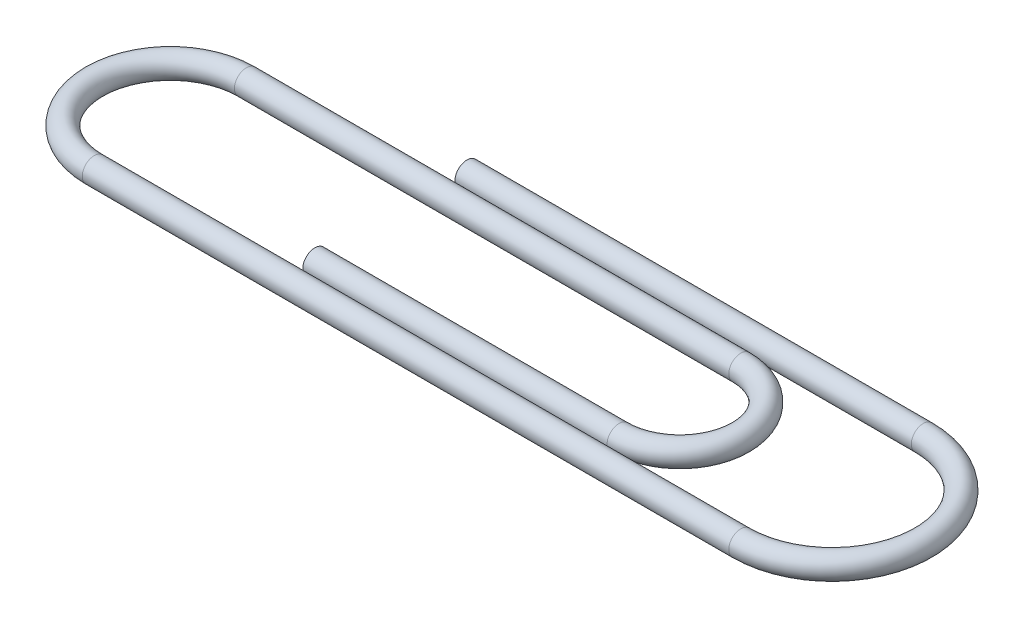
ISO-10303-21;
HEADER;
FILE_DESCRIPTION(('STEP AP214'),'2;1');
FILE_NAME('part.step','',(''),(''),'','','');
FILE_SCHEMA(('AUTOMOTIVE_DESIGN { 1 0 10303 214 1 1 1 1 }'));
ENDSEC;
DATA;
#1=APPLICATION_CONTEXT('core data for automotive mechanical design processes');
#2=APPLICATION_PROTOCOL_DEFINITION('international standard','automotive_design',2000,#1);
#3=PRODUCT_CONTEXT('',#1,'mechanical');
#4=PRODUCT('Part','Part','',(#3));
#5=PRODUCT_RELATED_PRODUCT_CATEGORY('part','',(#4));
#6=PRODUCT_DEFINITION_FORMATION('','',#4);
#7=PRODUCT_DEFINITION_CONTEXT('part definition',#1,'design');
#8=PRODUCT_DEFINITION('design','',#6,#7);
#9=PRODUCT_DEFINITION_SHAPE('','',#8);
#10=(LENGTH_UNIT() NAMED_UNIT(*) SI_UNIT(.MILLI.,.METRE.));
#11=(NAMED_UNIT(*) PLANE_ANGLE_UNIT() SI_UNIT($,.RADIAN.));
#12=(NAMED_UNIT(*) SI_UNIT($,.STERADIAN.) SOLID_ANGLE_UNIT());
#13=UNCERTAINTY_MEASURE_WITH_UNIT(LENGTH_MEASURE(1.E-05),#10,'distance_accuracy_value','');
#14=(GEOMETRIC_REPRESENTATION_CONTEXT(3) GLOBAL_UNCERTAINTY_ASSIGNED_CONTEXT((#13)) GLOBAL_UNIT_ASSIGNED_CONTEXT((#10,
#11,#12)) REPRESENTATION_CONTEXT('',''));
#15=CARTESIAN_POINT('',(0.,0.,0.));
#16=DIRECTION('',(0.,0.,1.));
#17=DIRECTION('',(1.,0.,0.));
#18=AXIS2_PLACEMENT_3D('',#15,#16,#17);
#19=CARTESIAN_POINT('',(0.,0.,0.));
#20=DIRECTION('',(1.,0.,0.));
#21=DIRECTION('',(0.,0.,-1.));
#22=AXIS2_PLACEMENT_3D('',#19,#20,#21);
#23=PLANE('',#22);
#24=CARTESIAN_POINT('',(0.,0.,0.));
#25=DIRECTION('',(1.,0.,0.));
#26=DIRECTION('',(0.,0.,-1.));
#27=AXIS2_PLACEMENT_3D('',#24,#25,#26);
#28=CIRCLE('',#27,7.88614630038445);
#29=CARTESIAN_POINT('',(0.,0.,-7.88614630038445));
#30=VERTEX_POINT('',#29);
#31=EDGE_CURVE('E53',#30,#30,#28,.T.);
#32=ORIENTED_EDGE('',*,*,#31,.F.);
#33=EDGE_LOOP('',(#32));
#34=FACE_BOUND('',#33,.T.);
#35=ADVANCED_FACE('F41',(#34),#23,.F.);
#36=CARTESIAN_POINT('',(0.,0.,-99.9999999999999));
#37=DIRECTION('',(-1.,0.,0.));
#38=DIRECTION('',(0.,0.,1.));
#39=AXIS2_PLACEMENT_3D('',#36,#37,#38);
#40=PLANE('',#39);
#41=CARTESIAN_POINT('',(0.,0.,-99.9999999999999));
#42=DIRECTION('',(-1.,0.,0.));
#43=DIRECTION('',(0.,0.,1.));
#44=AXIS2_PLACEMENT_3D('',#41,#42,#43);
#45=CIRCLE('',#44,7.88614630038445);
#46=CARTESIAN_POINT('',(0.,0.,-92.1138536996155));
#47=VERTEX_POINT('',#46);
#48=EDGE_CURVE('E11',#47,#47,#45,.T.);
#49=ORIENTED_EDGE('',*,*,#48,.T.);
#50=EDGE_LOOP('',(#49));
#51=FACE_BOUND('',#50,.T.);
#52=ADVANCED_FACE('F56',(#51),#40,.T.);
#53=CARTESIAN_POINT('',(0.,0.,0.));
#54=DIRECTION('',(1.,0.,0.));
#55=DIRECTION('',(0.,0.,-1.));
#56=AXIS2_PLACEMENT_3D('',#53,#54,#55);
#57=CYLINDRICAL_SURFACE('',#56,7.88614630038445);
#58=CARTESIAN_POINT('',(200.,0.,0.));
#59=DIRECTION('',(1.,0.,0.));
#60=DIRECTION('',(0.,0.,-1.));
#61=AXIS2_PLACEMENT_3D('',#58,#59,#60);
#62=CIRCLE('',#61,7.88614630038445);
#63=CARTESIAN_POINT('',(200.,0.,7.88614630038444));
#64=VERTEX_POINT('',#63);
#65=EDGE_CURVE('E79',#64,#64,#62,.T.);
#66=ORIENTED_EDGE('',*,*,#65,.F.);
#67=EDGE_LOOP('',(#66));
#68=FACE_BOUND('',#67,.T.);
#69=ORIENTED_EDGE('',*,*,#31,.T.);
#70=EDGE_LOOP('',(#69));
#71=FACE_BOUND('',#70,.T.);
#72=ADVANCED_FACE('F83',(#68,#71),#57,.T.);
#73=CARTESIAN_POINT('',(200.,0.,-40.));
#74=DIRECTION('',(0.,1.,0.));
#75=DIRECTION('',(0.,0.,1.));
#76=AXIS2_PLACEMENT_3D('',#73,#74,#75);
#77=TOROIDAL_SURFACE('',#76,40.,7.88614630038445);
#78=CARTESIAN_POINT('',(200.,0.,-80.));
#79=DIRECTION('',(-1.,0.,0.));
#80=DIRECTION('',(0.,0.,1.));
#81=AXIS2_PLACEMENT_3D('',#78,#79,#80);
#82=CIRCLE('',#81,7.88614630038445);
#83=CARTESIAN_POINT('',(200.,0.,-87.8861463003844));
#84=VERTEX_POINT('',#83);
#85=EDGE_CURVE('E76',#84,#84,#82,.T.);
#86=CARTESIAN_POINT('',(200.,0.,-40.));
#87=DIRECTION('',(0.,1.,0.));
#88=DIRECTION('',(0.,0.,1.));
#89=AXIS2_PLACEMENT_3D('',#86,#87,#88);
#90=CIRCLE('',#89,47.8861463003844);
#91=EDGE_CURVE('',#64,#84,#90,.T.);
#92=ORIENTED_EDGE('',*,*,#65,.T.);
#93=ORIENTED_EDGE('',*,*,#85,.F.);
#94=ORIENTED_EDGE('',*,*,#91,.T.);
#95=ORIENTED_EDGE('',*,*,#91,.F.);
#96=EDGE_LOOP('',(#92,#94,#93,#95));
#97=FACE_BOUND('',#96,.T.);
#98=ADVANCED_FACE('F85',(#97),#77,.T.);
#99=CARTESIAN_POINT('',(200.,0.,-80.));
#100=DIRECTION('',(-1.,0.,0.));
#101=DIRECTION('',(0.,0.,1.));
#102=AXIS2_PLACEMENT_3D('',#99,#100,#101);
#103=CYLINDRICAL_SURFACE('',#102,7.88614630038445);
#104=CARTESIAN_POINT('',(-125.,0.,-80.));
#105=DIRECTION('',(-1.,0.,0.));
#106=DIRECTION('',(0.,0.,1.));
#107=AXIS2_PLACEMENT_3D('',#104,#105,#106);
#108=CIRCLE('',#107,7.88614630038445);
#109=CARTESIAN_POINT('',(-125.,0.,-87.8861463003844));
#110=VERTEX_POINT('',#109);
#111=EDGE_CURVE('E73',#110,#110,#108,.T.);
#112=ORIENTED_EDGE('',*,*,#111,.F.);
#113=EDGE_LOOP('',(#112));
#114=FACE_BOUND('',#113,.T.);
#115=ORIENTED_EDGE('',*,*,#85,.T.);
#116=EDGE_LOOP('',(#115));
#117=FACE_BOUND('',#116,.T.);
#118=ADVANCED_FACE('F92',(#114,#117),#103,.T.);
#119=CARTESIAN_POINT('',(-125.,0.,-29.9999999999999));
#120=DIRECTION('',(0.,1.,0.));
#121=DIRECTION('',(0.,0.,1.));
#122=AXIS2_PLACEMENT_3D('',#119,#120,#121);
#123=TOROIDAL_SURFACE('',#122,50.,7.88614630038445);
#124=CARTESIAN_POINT('',(-125.,0.,20.0000000000001));
#125=DIRECTION('',(1.,0.,0.));
#126=DIRECTION('',(0.,0.,-1.));
#127=AXIS2_PLACEMENT_3D('',#124,#125,#126);
#128=CIRCLE('',#127,7.88614630038445);
#129=CARTESIAN_POINT('',(-125.,0.,27.8861463003845));
#130=VERTEX_POINT('',#129);
#131=EDGE_CURVE('E68',#130,#130,#128,.T.);
#132=CARTESIAN_POINT('',(-125.,0.,-29.9999999999999));
#133=DIRECTION('',(0.,1.,0.));
#134=DIRECTION('',(0.,0.,1.));
#135=AXIS2_PLACEMENT_3D('',#132,#133,#134);
#136=CIRCLE('',#135,57.8861463003845);
#137=EDGE_CURVE('',#110,#130,#136,.T.);
#138=ORIENTED_EDGE('',*,*,#111,.T.);
#139=ORIENTED_EDGE('',*,*,#131,.F.);
#140=ORIENTED_EDGE('',*,*,#137,.T.);
#141=ORIENTED_EDGE('',*,*,#137,.F.);
#142=EDGE_LOOP('',(#138,#140,#139,#141));
#143=FACE_BOUND('',#142,.T.);
#144=ADVANCED_FACE('F99',(#143),#123,.T.);
#145=CARTESIAN_POINT('',(-125.,0.,20.0000000000001));
#146=DIRECTION('',(1.,0.,0.));
#147=DIRECTION('',(0.,0.,-1.));
#148=AXIS2_PLACEMENT_3D('',#145,#146,#147);
#149=CYLINDRICAL_SURFACE('',#148,7.88614630038445);
#150=CARTESIAN_POINT('',(300.,0.,20.));
#151=DIRECTION('',(1.,0.,0.));
#152=DIRECTION('',(0.,0.,-1.));
#153=AXIS2_PLACEMENT_3D('',#150,#151,#152);
#154=CIRCLE('',#153,7.88614630038445);
#155=CARTESIAN_POINT('',(300.,0.,27.8861463003845));
#156=VERTEX_POINT('',#155);
#157=EDGE_CURVE('E66',#156,#156,#154,.T.);
#158=ORIENTED_EDGE('',*,*,#157,.F.);
#159=EDGE_LOOP('',(#158));
#160=FACE_BOUND('',#159,.T.);
#161=ORIENTED_EDGE('',*,*,#131,.T.);
#162=EDGE_LOOP('',(#161));
#163=FACE_BOUND('',#162,.T.);
#164=ADVANCED_FACE('F103',(#160,#163),#149,.T.);
#165=CARTESIAN_POINT('',(300.,0.,-40.));
#166=DIRECTION('',(0.,1.,0.));
#167=DIRECTION('',(0.,0.,1.));
#168=AXIS2_PLACEMENT_3D('',#165,#166,#167);
#169=TOROIDAL_SURFACE('',#168,60.,7.88614630038445);
#170=CARTESIAN_POINT('',(300.,0.,-99.9999999999999));
#171=DIRECTION('',(-1.,0.,0.));
#172=DIRECTION('',(0.,0.,1.));
#173=AXIS2_PLACEMENT_3D('',#170,#171,#172);
#174=CIRCLE('',#173,7.88614630038445);
#175=CARTESIAN_POINT('',(300.,0.,-107.886146300384));
#176=VERTEX_POINT('',#175);
#177=EDGE_CURVE('E48',#176,#176,#174,.T.);
#178=CARTESIAN_POINT('',(300.,0.,-40.));
#179=DIRECTION('',(0.,1.,0.));
#180=DIRECTION('',(0.,0.,1.));
#181=AXIS2_PLACEMENT_3D('',#178,#179,#180);
#182=CIRCLE('',#181,67.8861463003845);
#183=EDGE_CURVE('',#156,#176,#182,.T.);
#184=ORIENTED_EDGE('',*,*,#157,.T.);
#185=ORIENTED_EDGE('',*,*,#177,.F.);
#186=ORIENTED_EDGE('',*,*,#183,.T.);
#187=ORIENTED_EDGE('',*,*,#183,.F.);
#188=EDGE_LOOP('',(#184,#186,#185,#187));
#189=FACE_BOUND('',#188,.T.);
#190=ADVANCED_FACE('F61',(#189),#169,.T.);
#191=CARTESIAN_POINT('',(300.,0.,-99.9999999999999));
#192=DIRECTION('',(-1.,0.,0.));
#193=DIRECTION('',(0.,0.,1.));
#194=AXIS2_PLACEMENT_3D('',#191,#192,#193);
#195=CYLINDRICAL_SURFACE('',#194,7.88614630038445);
#196=ORIENTED_EDGE('',*,*,#48,.F.);
#197=EDGE_LOOP('',(#196));
#198=FACE_BOUND('',#197,.T.);
#199=ORIENTED_EDGE('',*,*,#177,.T.);
#200=EDGE_LOOP('',(#199));
#201=FACE_BOUND('',#200,.T.);
#202=ADVANCED_FACE('F58',(#198,#201),#195,.T.);
#203=CLOSED_SHELL('',(#35,#52,#72,#98,#118,#144,#164,#190,#202));
#204=MANIFOLD_SOLID_BREP('B2',#203);
#205=ADVANCED_BREP_SHAPE_REPRESENTATION('',(#18,#204),#14);
#206=SHAPE_DEFINITION_REPRESENTATION(#9,#205);
ENDSEC;
END-ISO-10303-21;
